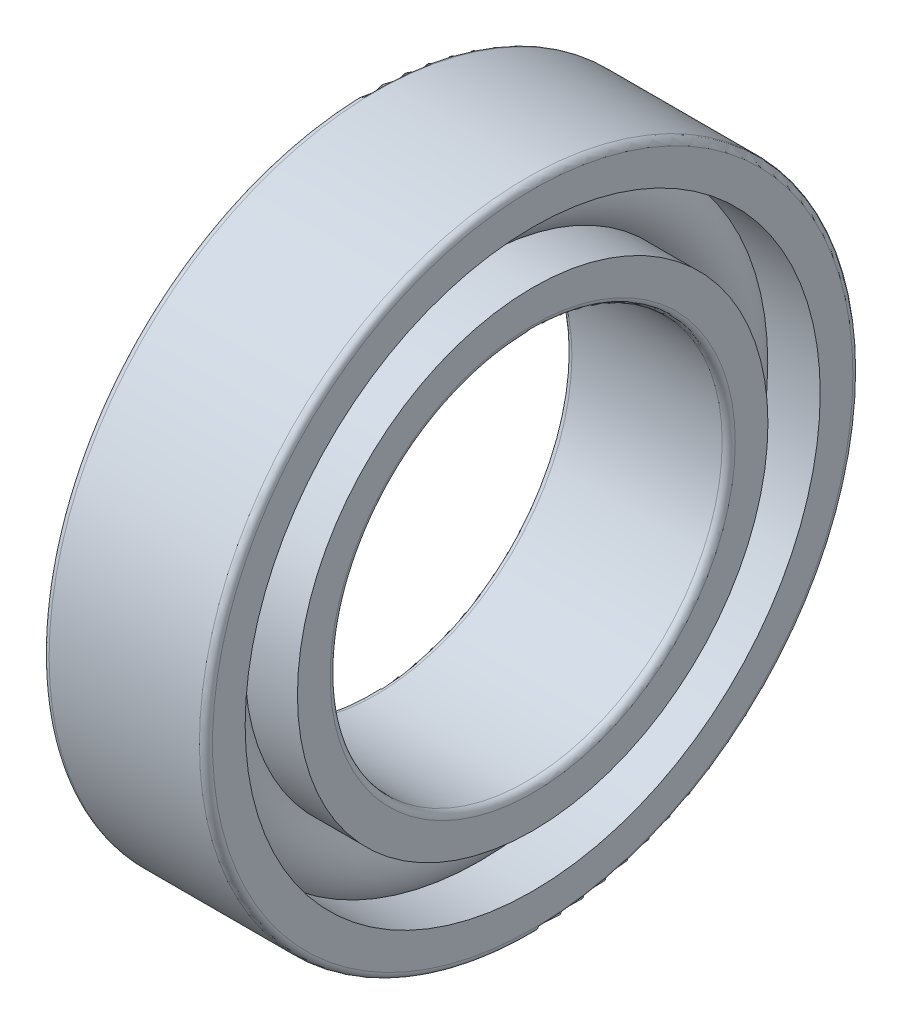
ISO-10303-21;
HEADER;
FILE_DESCRIPTION(('STEP AP214'),'2;1');
FILE_NAME('part.step','',(''),(''),'','','');
FILE_SCHEMA(('AUTOMOTIVE_DESIGN { 1 0 10303 214 1 1 1 1 }'));
ENDSEC;
DATA;
#1=APPLICATION_CONTEXT('core data for automotive mechanical design processes');
#2=APPLICATION_PROTOCOL_DEFINITION('international standard','automotive_design',2000,#1);
#3=PRODUCT_CONTEXT('',#1,'mechanical');
#4=PRODUCT('Part','Part','',(#3));
#5=PRODUCT_RELATED_PRODUCT_CATEGORY('part','',(#4));
#6=PRODUCT_DEFINITION_FORMATION('','',#4);
#7=PRODUCT_DEFINITION_CONTEXT('part definition',#1,'design');
#8=PRODUCT_DEFINITION('design','',#6,#7);
#9=PRODUCT_DEFINITION_SHAPE('','',#8);
#10=(LENGTH_UNIT() NAMED_UNIT(*) SI_UNIT(.MILLI.,.METRE.));
#11=(NAMED_UNIT(*) PLANE_ANGLE_UNIT() SI_UNIT($,.RADIAN.));
#12=(NAMED_UNIT(*) SI_UNIT($,.STERADIAN.) SOLID_ANGLE_UNIT());
#13=UNCERTAINTY_MEASURE_WITH_UNIT(LENGTH_MEASURE(1.E-05),#10,'distance_accuracy_value','');
#14=(GEOMETRIC_REPRESENTATION_CONTEXT(3) GLOBAL_UNCERTAINTY_ASSIGNED_CONTEXT((#13)) GLOBAL_UNIT_ASSIGNED_CONTEXT((#10,
#11,#12)) REPRESENTATION_CONTEXT('',''));
#15=CARTESIAN_POINT('',(0.,0.,0.));
#16=DIRECTION('',(0.,0.,1.));
#17=DIRECTION('',(1.,0.,0.));
#18=AXIS2_PLACEMENT_3D('',#15,#16,#17);
#19=CARTESIAN_POINT('',(0.,0.,0.));
#20=DIRECTION('',(-1.,0.,0.));
#21=DIRECTION('',(0.,0.,1.));
#22=AXIS2_PLACEMENT_3D('',#19,#20,#21);
#23=TOROIDAL_SURFACE('',#22,4.,0.6);
#24=CARTESIAN_POINT('',(0.447213595499952,0.,0.));
#25=DIRECTION('',(-1.,0.,0.));
#26=DIRECTION('',(0.,0.,1.));
#27=AXIS2_PLACEMENT_3D('',#24,#25,#26);
#28=CIRCLE('',#27,4.40000000000001);
#29=CARTESIAN_POINT('',(0.447213595499952,0.,4.40000000000001));
#30=VERTEX_POINT('',#29);
#31=EDGE_CURVE('E35',#30,#30,#28,.F.);
#32=ORIENTED_EDGE('',*,*,#31,.T.);
#33=EDGE_LOOP('',(#32));
#34=FACE_BOUND('',#33,.T.);
#35=CARTESIAN_POINT('',(0.447213595499957,0.,0.));
#36=DIRECTION('',(-1.,0.,0.));
#37=DIRECTION('',(0.,0.,1.));
#38=AXIS2_PLACEMENT_3D('',#35,#36,#37);
#39=CIRCLE('',#38,3.6);
#40=CARTESIAN_POINT('',(0.447213595499957,0.,3.6));
#41=VERTEX_POINT('',#40);
#42=EDGE_CURVE('E10',#41,#41,#39,.T.);
#43=ORIENTED_EDGE('',*,*,#42,.T.);
#44=EDGE_LOOP('',(#43));
#45=FACE_BOUND('',#44,.T.);
#46=ADVANCED_FACE('F31',(#34,#45),#23,.T.);
#47=CARTESIAN_POINT('',(-20.6375,0.,0.));
#48=DIRECTION('',(1.,0.,0.));
#49=DIRECTION('',(0.,0.,-1.));
#50=AXIS2_PLACEMENT_3D('',#47,#48,#49);
#51=CYLINDRICAL_SURFACE('',#50,3.6);
#52=CARTESIAN_POINT('',(1.25,0.,0.));
#53=DIRECTION('',(1.,0.,0.));
#54=DIRECTION('',(0.,0.,-1.));
#55=AXIS2_PLACEMENT_3D('',#52,#53,#54);
#56=CIRCLE('',#55,3.6);
#57=CARTESIAN_POINT('',(1.25,0.,-3.6));
#58=VERTEX_POINT('',#57);
#59=EDGE_CURVE('E44',#58,#58,#56,.T.);
#60=ORIENTED_EDGE('',*,*,#59,.F.);
#61=EDGE_LOOP('',(#60));
#62=FACE_BOUND('',#61,.T.);
#63=ORIENTED_EDGE('',*,*,#42,.F.);
#64=EDGE_LOOP('',(#63));
#65=FACE_BOUND('',#64,.T.);
#66=ADVANCED_FACE('F83',(#62,#65),#51,.T.);
#67=CARTESIAN_POINT('',(-20.6375,0.,0.));
#68=DIRECTION('',(1.,0.,0.));
#69=DIRECTION('',(0.,0.,-1.));
#70=AXIS2_PLACEMENT_3D('',#67,#68,#69);
#71=CYLINDRICAL_SURFACE('',#70,3.6);
#72=CARTESIAN_POINT('',(-1.25,0.,0.));
#73=DIRECTION('',(1.,0.,0.));
#74=DIRECTION('',(0.,0.,-1.));
#75=AXIS2_PLACEMENT_3D('',#72,#73,#74);
#76=CIRCLE('',#75,3.6);
#77=CARTESIAN_POINT('',(-1.25,0.,-3.6));
#78=VERTEX_POINT('',#77);
#79=EDGE_CURVE('E53',#78,#78,#76,.T.);
#80=ORIENTED_EDGE('',*,*,#79,.T.);
#81=EDGE_LOOP('',(#80));
#82=FACE_BOUND('',#81,.T.);
#83=CARTESIAN_POINT('',(-0.447213595499957,0.,0.));
#84=DIRECTION('',(1.,0.,0.));
#85=DIRECTION('',(0.,0.,-1.));
#86=AXIS2_PLACEMENT_3D('',#83,#84,#85);
#87=CIRCLE('',#86,3.6);
#88=CARTESIAN_POINT('',(-0.447213595499957,0.,-3.6));
#89=VERTEX_POINT('',#88);
#90=EDGE_CURVE('E39',#89,#89,#87,.T.);
#91=ORIENTED_EDGE('',*,*,#90,.F.);
#92=EDGE_LOOP('',(#91));
#93=FACE_BOUND('',#92,.T.);
#94=ADVANCED_FACE('F86',(#82,#93),#71,.T.);
#95=CARTESIAN_POINT('',(1.25,3.1,0.));
#96=DIRECTION('',(1.,0.,0.));
#97=DIRECTION('',(0.,0.,-1.));
#98=AXIS2_PLACEMENT_3D('',#95,#96,#97);
#99=PLANE('',#98);
#100=ORIENTED_EDGE('',*,*,#59,.T.);
#101=EDGE_LOOP('',(#100));
#102=FACE_BOUND('',#101,.T.);
#103=CARTESIAN_POINT('',(1.25,0.,0.));
#104=DIRECTION('',(1.,0.,0.));
#105=DIRECTION('',(0.,0.,-1.));
#106=AXIS2_PLACEMENT_3D('',#103,#104,#105);
#107=CIRCLE('',#106,3.1);
#108=CARTESIAN_POINT('',(1.25,0.,-3.1));
#109=VERTEX_POINT('',#108);
#110=EDGE_CURVE('E75',#109,#109,#107,.T.);
#111=ORIENTED_EDGE('',*,*,#110,.F.);
#112=EDGE_LOOP('',(#111));
#113=FACE_BOUND('',#112,.T.);
#114=ADVANCED_FACE('F80',(#102,#113),#99,.T.);
#115=CARTESIAN_POINT('',(1.15,0.,0.));
#116=DIRECTION('',(1.,0.,0.));
#117=DIRECTION('',(0.,0.,-1.));
#118=AXIS2_PLACEMENT_3D('',#115,#116,#117);
#119=TOROIDAL_SURFACE('',#118,3.1,0.0999999999999998);
#120=ORIENTED_EDGE('',*,*,#110,.T.);
#121=EDGE_LOOP('',(#120));
#122=FACE_BOUND('',#121,.T.);
#123=CARTESIAN_POINT('',(1.15,0.,0.));
#124=DIRECTION('',(1.,0.,0.));
#125=DIRECTION('',(0.,0.,-1.));
#126=AXIS2_PLACEMENT_3D('',#123,#124,#125);
#127=CIRCLE('',#126,3.);
#128=CARTESIAN_POINT('',(1.15,0.,-3.));
#129=VERTEX_POINT('',#128);
#130=EDGE_CURVE('E72',#129,#129,#127,.T.);
#131=ORIENTED_EDGE('',*,*,#130,.F.);
#132=EDGE_LOOP('',(#131));
#133=FACE_BOUND('',#132,.T.);
#134=ADVANCED_FACE('F97',(#122,#133),#119,.T.);
#135=CARTESIAN_POINT('',(-20.6375,0.,0.));
#136=DIRECTION('',(1.,0.,0.));
#137=DIRECTION('',(0.,0.,-1.));
#138=AXIS2_PLACEMENT_3D('',#135,#136,#137);
#139=CYLINDRICAL_SURFACE('',#138,3.);
#140=ORIENTED_EDGE('',*,*,#130,.T.);
#141=EDGE_LOOP('',(#140));
#142=FACE_BOUND('',#141,.T.);
#143=CARTESIAN_POINT('',(-1.15,0.,0.));
#144=DIRECTION('',(1.,0.,0.));
#145=DIRECTION('',(0.,0.,-1.));
#146=AXIS2_PLACEMENT_3D('',#143,#144,#145);
#147=CIRCLE('',#146,3.);
#148=CARTESIAN_POINT('',(-1.15,0.,-3.));
#149=VERTEX_POINT('',#148);
#150=EDGE_CURVE('E69',#149,#149,#147,.T.);
#151=ORIENTED_EDGE('',*,*,#150,.F.);
#152=EDGE_LOOP('',(#151));
#153=FACE_BOUND('',#152,.T.);
#154=ADVANCED_FACE('F100',(#142,#153),#139,.F.);
#155=CARTESIAN_POINT('',(-1.15,0.,0.));
#156=DIRECTION('',(1.,0.,0.));
#157=DIRECTION('',(0.,0.,-1.));
#158=AXIS2_PLACEMENT_3D('',#155,#156,#157);
#159=TOROIDAL_SURFACE('',#158,3.1,0.0999999999999998);
#160=ORIENTED_EDGE('',*,*,#150,.T.);
#161=EDGE_LOOP('',(#160));
#162=FACE_BOUND('',#161,.T.);
#163=CARTESIAN_POINT('',(-1.25,0.,0.));
#164=DIRECTION('',(1.,0.,0.));
#165=DIRECTION('',(0.,0.,-1.));
#166=AXIS2_PLACEMENT_3D('',#163,#164,#165);
#167=CIRCLE('',#166,3.1);
#168=CARTESIAN_POINT('',(-1.25,0.,-3.1));
#169=VERTEX_POINT('',#168);
#170=EDGE_CURVE('E66',#169,#169,#167,.T.);
#171=ORIENTED_EDGE('',*,*,#170,.F.);
#172=EDGE_LOOP('',(#171));
#173=FACE_BOUND('',#172,.T.);
#174=ADVANCED_FACE('F104',(#162,#173),#159,.T.);
#175=CARTESIAN_POINT('',(-1.25,3.6,0.));
#176=DIRECTION('',(-1.,0.,0.));
#177=DIRECTION('',(0.,0.,1.));
#178=AXIS2_PLACEMENT_3D('',#175,#176,#177);
#179=PLANE('',#178);
#180=ORIENTED_EDGE('',*,*,#170,.T.);
#181=EDGE_LOOP('',(#180));
#182=FACE_BOUND('',#181,.T.);
#183=ORIENTED_EDGE('',*,*,#79,.F.);
#184=EDGE_LOOP('',(#183));
#185=FACE_BOUND('',#184,.T.);
#186=ADVANCED_FACE('F108',(#182,#185),#179,.T.);
#187=CARTESIAN_POINT('',(-0.447213595499952,0.,0.));
#188=DIRECTION('',(1.,0.,0.));
#189=DIRECTION('',(0.,0.,-1.));
#190=AXIS2_PLACEMENT_3D('',#187,#188,#189);
#191=CIRCLE('',#190,4.40000000000001);
#192=CARTESIAN_POINT('',(-0.447213595499952,0.,-4.40000000000001));
#193=VERTEX_POINT('',#192);
#194=EDGE_CURVE('E47',#193,#193,#191,.F.);
#195=ORIENTED_EDGE('',*,*,#194,.T.);
#196=EDGE_LOOP('',(#195));
#197=FACE_BOUND('',#196,.T.);
#198=ORIENTED_EDGE('',*,*,#90,.T.);
#199=EDGE_LOOP('',(#198));
#200=FACE_BOUND('',#199,.T.);
#201=ADVANCED_FACE('F33',(#197,#200),#23,.T.);
#202=CARTESIAN_POINT('',(-20.6375,0.,0.));
#203=DIRECTION('',(1.,0.,0.));
#204=DIRECTION('',(0.,0.,-1.));
#205=AXIS2_PLACEMENT_3D('',#202,#203,#204);
#206=CYLINDRICAL_SURFACE('',#205,4.40000000000001);
#207=CARTESIAN_POINT('',(1.25,0.,0.));
#208=DIRECTION('',(1.,0.,0.));
#209=DIRECTION('',(0.,0.,-1.));
#210=AXIS2_PLACEMENT_3D('',#207,#208,#209);
#211=CIRCLE('',#210,4.40000000000001);
#212=CARTESIAN_POINT('',(1.25,0.,-4.40000000000001));
#213=VERTEX_POINT('',#212);
#214=EDGE_CURVE('E49',#213,#213,#211,.T.);
#215=ORIENTED_EDGE('',*,*,#214,.T.);
#216=EDGE_LOOP('',(#215));
#217=FACE_BOUND('',#216,.T.);
#218=ORIENTED_EDGE('',*,*,#31,.F.);
#219=EDGE_LOOP('',(#218));
#220=FACE_BOUND('',#219,.T.);
#221=ADVANCED_FACE('F113',(#217,#220),#206,.F.);
#222=CARTESIAN_POINT('',(-20.6375,0.,0.));
#223=DIRECTION('',(1.,0.,0.));
#224=DIRECTION('',(0.,0.,-1.));
#225=AXIS2_PLACEMENT_3D('',#222,#223,#224);
#226=CYLINDRICAL_SURFACE('',#225,4.40000000000001);
#227=CARTESIAN_POINT('',(-1.25,0.,0.));
#228=DIRECTION('',(1.,0.,0.));
#229=DIRECTION('',(0.,0.,-1.));
#230=AXIS2_PLACEMENT_3D('',#227,#228,#229);
#231=CIRCLE('',#230,4.40000000000001);
#232=CARTESIAN_POINT('',(-1.25,0.,-4.40000000000001));
#233=VERTEX_POINT('',#232);
#234=EDGE_CURVE('E144',#233,#233,#231,.T.);
#235=ORIENTED_EDGE('',*,*,#234,.F.);
#236=EDGE_LOOP('',(#235));
#237=FACE_BOUND('',#236,.T.);
#238=ORIENTED_EDGE('',*,*,#194,.F.);
#239=EDGE_LOOP('',(#238));
#240=FACE_BOUND('',#239,.T.);
#241=ADVANCED_FACE('F116',(#237,#240),#226,.F.);
#242=CARTESIAN_POINT('',(1.25,4.90000000000001,0.));
#243=DIRECTION('',(1.,0.,0.));
#244=DIRECTION('',(0.,0.,-1.));
#245=AXIS2_PLACEMENT_3D('',#242,#243,#244);
#246=PLANE('',#245);
#247=CARTESIAN_POINT('',(1.25,0.,0.));
#248=DIRECTION('',(1.,0.,0.));
#249=DIRECTION('',(0.,0.,-1.));
#250=AXIS2_PLACEMENT_3D('',#247,#248,#249);
#251=CIRCLE('',#250,4.90000000000001);
#252=CARTESIAN_POINT('',(1.25,0.,-4.90000000000001));
#253=VERTEX_POINT('',#252);
#254=EDGE_CURVE('E55',#253,#253,#251,.T.);
#255=ORIENTED_EDGE('',*,*,#254,.T.);
#256=EDGE_LOOP('',(#255));
#257=FACE_BOUND('',#256,.T.);
#258=ORIENTED_EDGE('',*,*,#214,.F.);
#259=EDGE_LOOP('',(#258));
#260=FACE_BOUND('',#259,.T.);
#261=ADVANCED_FACE('F117',(#257,#260),#246,.T.);
#262=CARTESIAN_POINT('',(1.15,0.,0.));
#263=DIRECTION('',(1.,0.,0.));
#264=DIRECTION('',(0.,0.,-1.));
#265=AXIS2_PLACEMENT_3D('',#262,#263,#264);
#266=TOROIDAL_SURFACE('',#265,4.90000000000001,0.100000000000001);
#267=CARTESIAN_POINT('',(1.15,0.,0.));
#268=DIRECTION('',(1.,0.,0.));
#269=DIRECTION('',(0.,0.,-1.));
#270=AXIS2_PLACEMENT_3D('',#267,#268,#269);
#271=CIRCLE('',#270,5.00000000000001);
#272=CARTESIAN_POINT('',(1.15,0.,-5.00000000000001));
#273=VERTEX_POINT('',#272);
#274=EDGE_CURVE('E60',#273,#273,#271,.T.);
#275=ORIENTED_EDGE('',*,*,#274,.T.);
#276=EDGE_LOOP('',(#275));
#277=FACE_BOUND('',#276,.T.);
#278=ORIENTED_EDGE('',*,*,#254,.F.);
#279=EDGE_LOOP('',(#278));
#280=FACE_BOUND('',#279,.T.);
#281=ADVANCED_FACE('F120',(#277,#280),#266,.T.);
#282=CARTESIAN_POINT('',(-20.6375,0.,0.));
#283=DIRECTION('',(1.,0.,0.));
#284=DIRECTION('',(0.,0.,-1.));
#285=AXIS2_PLACEMENT_3D('',#282,#283,#284);
#286=CYLINDRICAL_SURFACE('',#285,5.00000000000001);
#287=CARTESIAN_POINT('',(-1.15,0.,0.));
#288=DIRECTION('',(1.,0.,0.));
#289=DIRECTION('',(0.,0.,-1.));
#290=AXIS2_PLACEMENT_3D('',#287,#288,#289);
#291=CIRCLE('',#290,5.00000000000001);
#292=CARTESIAN_POINT('',(-1.15,0.,-5.00000000000001));
#293=VERTEX_POINT('',#292);
#294=EDGE_CURVE('E148',#293,#293,#291,.T.);
#295=ORIENTED_EDGE('',*,*,#294,.T.);
#296=EDGE_LOOP('',(#295));
#297=FACE_BOUND('',#296,.T.);
#298=ORIENTED_EDGE('',*,*,#274,.F.);
#299=EDGE_LOOP('',(#298));
#300=FACE_BOUND('',#299,.T.);
#301=ADVANCED_FACE('F124',(#297,#300),#286,.T.);
#302=CARTESIAN_POINT('',(-1.15,0.,0.));
#303=DIRECTION('',(1.,0.,0.));
#304=DIRECTION('',(0.,0.,-1.));
#305=AXIS2_PLACEMENT_3D('',#302,#303,#304);
#306=TOROIDAL_SURFACE('',#305,4.90000000000001,0.100000000000001);
#307=CARTESIAN_POINT('',(-1.25,0.,0.));
#308=DIRECTION('',(1.,0.,0.));
#309=DIRECTION('',(0.,0.,-1.));
#310=AXIS2_PLACEMENT_3D('',#307,#308,#309);
#311=CIRCLE('',#310,4.90000000000001);
#312=CARTESIAN_POINT('',(-1.25,0.,-4.90000000000001));
#313=VERTEX_POINT('',#312);
#314=EDGE_CURVE('E145',#313,#313,#311,.T.);
#315=ORIENTED_EDGE('',*,*,#314,.T.);
#316=EDGE_LOOP('',(#315));
#317=FACE_BOUND('',#316,.T.);
#318=ORIENTED_EDGE('',*,*,#294,.F.);
#319=EDGE_LOOP('',(#318));
#320=FACE_BOUND('',#319,.T.);
#321=ADVANCED_FACE('F128',(#317,#320),#306,.T.);
#322=CARTESIAN_POINT('',(-1.25,4.40000000000001,0.));
#323=DIRECTION('',(-1.,0.,0.));
#324=DIRECTION('',(0.,0.,1.));
#325=AXIS2_PLACEMENT_3D('',#322,#323,#324);
#326=PLANE('',#325);
#327=ORIENTED_EDGE('',*,*,#234,.T.);
#328=EDGE_LOOP('',(#327));
#329=FACE_BOUND('',#328,.T.);
#330=ORIENTED_EDGE('',*,*,#314,.F.);
#331=EDGE_LOOP('',(#330));
#332=FACE_BOUND('',#331,.T.);
#333=ADVANCED_FACE('F132',(#329,#332),#326,.T.);
#334=CLOSED_SHELL('',(#46,#66,#94,#114,#134,#154,#174,#186,#201,#221,#241,#261,#281,#301,#321,#333));
#335=MANIFOLD_SOLID_BREP('B2',#334);
#336=ADVANCED_BREP_SHAPE_REPRESENTATION('',(#18,#335),#14);
#337=SHAPE_DEFINITION_REPRESENTATION(#9,#336);
ENDSEC;
END-ISO-10303-21;
